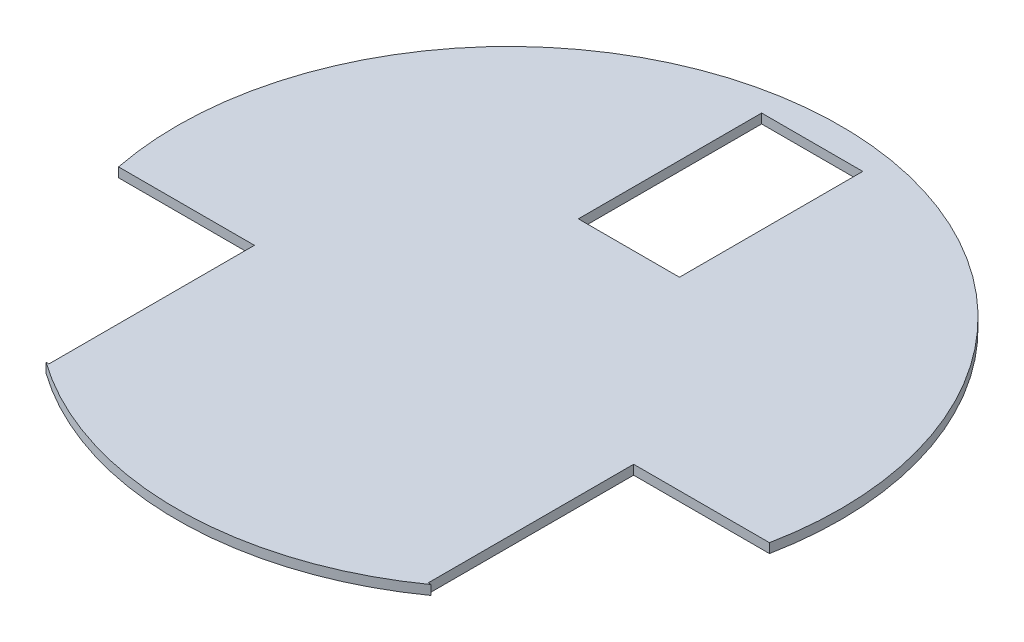
ISO-10303-21;
HEADER;
FILE_DESCRIPTION(('STEP AP214'),'2;1');
FILE_NAME('part.step','',(''),(''),'','','');
FILE_SCHEMA(('AUTOMOTIVE_DESIGN { 1 0 10303 214 1 1 1 1 }'));
ENDSEC;
DATA;
#1=APPLICATION_CONTEXT('core data for automotive mechanical design processes');
#2=APPLICATION_PROTOCOL_DEFINITION('international standard','automotive_design',2000,#1);
#3=PRODUCT_CONTEXT('',#1,'mechanical');
#4=PRODUCT('Part','Part','',(#3));
#5=PRODUCT_RELATED_PRODUCT_CATEGORY('part','',(#4));
#6=PRODUCT_DEFINITION_FORMATION('','',#4);
#7=PRODUCT_DEFINITION_CONTEXT('part definition',#1,'design');
#8=PRODUCT_DEFINITION('design','',#6,#7);
#9=PRODUCT_DEFINITION_SHAPE('','',#8);
#10=(LENGTH_UNIT() NAMED_UNIT(*) SI_UNIT(.MILLI.,.METRE.));
#11=(NAMED_UNIT(*) PLANE_ANGLE_UNIT() SI_UNIT($,.RADIAN.));
#12=(NAMED_UNIT(*) SI_UNIT($,.STERADIAN.) SOLID_ANGLE_UNIT());
#13=UNCERTAINTY_MEASURE_WITH_UNIT(LENGTH_MEASURE(1.E-05),#10,'distance_accuracy_value','');
#14=(GEOMETRIC_REPRESENTATION_CONTEXT(3) GLOBAL_UNCERTAINTY_ASSIGNED_CONTEXT((#13)) GLOBAL_UNIT_ASSIGNED_CONTEXT((#10,
#11,#12)) REPRESENTATION_CONTEXT('',''));
#15=CARTESIAN_POINT('',(0.,0.,0.));
#16=DIRECTION('',(0.,0.,1.));
#17=DIRECTION('',(1.,0.,0.));
#18=AXIS2_PLACEMENT_3D('',#15,#16,#17);
#19=CARTESIAN_POINT('',(0.,3.,0.));
#20=DIRECTION('',(0.,-1.,0.));
#21=DIRECTION('',(0.,0.,-1.));
#22=AXIS2_PLACEMENT_3D('',#19,#20,#21);
#23=CYLINDRICAL_SURFACE('',#22,105.);
#24=DIRECTION('',(0.,1.,0.));
#25=VECTOR('',#24,1.);
#26=CARTESIAN_POINT('',(60.9487489617301,0.,85.5));
#27=LINE('',#26,#25);
#28=CARTESIAN_POINT('',(60.9487489617301,0.,85.5));
#29=VERTEX_POINT('',#28);
#30=CARTESIAN_POINT('',(60.9487489617301,3.,85.5));
#31=VERTEX_POINT('',#30);
#32=EDGE_CURVE('E178',#29,#31,#27,.T.);
#33=ORIENTED_EDGE('',*,*,#32,.T.);
#34=CARTESIAN_POINT('',(0.,3.,0.));
#35=DIRECTION('',(0.,1.,0.));
#36=DIRECTION('',(0.,0.,1.));
#37=AXIS2_PLACEMENT_3D('',#34,#35,#36);
#38=CIRCLE('',#37,105.);
#39=CARTESIAN_POINT('',(-60.9487489617301,3.,85.5));
#40=VERTEX_POINT('',#39);
#41=EDGE_CURVE('E11',#40,#31,#38,.T.);
#42=ORIENTED_EDGE('',*,*,#41,.F.);
#43=DIRECTION('',(0.,1.,0.));
#44=VECTOR('',#43,1.);
#45=CARTESIAN_POINT('',(-60.9487489617301,0.,85.5));
#46=LINE('',#45,#44);
#47=CARTESIAN_POINT('',(-60.9487489617301,0.,85.5));
#48=VERTEX_POINT('',#47);
#49=EDGE_CURVE('E206',#48,#40,#46,.T.);
#50=ORIENTED_EDGE('',*,*,#49,.F.);
#51=CARTESIAN_POINT('',(0.,0.,0.));
#52=DIRECTION('',(0.,1.,0.));
#53=DIRECTION('',(0.,0.,1.));
#54=AXIS2_PLACEMENT_3D('',#51,#52,#53);
#55=CIRCLE('',#54,105.);
#56=EDGE_CURVE('E38',#48,#29,#55,.T.);
#57=ORIENTED_EDGE('',*,*,#56,.T.);
#58=EDGE_LOOP('',(#33,#42,#50,#57));
#59=FACE_BOUND('',#58,.T.);
#60=ADVANCED_FACE('F34',(#59),#23,.T.);
#61=CARTESIAN_POINT('',(0.,3.,0.));
#62=DIRECTION('',(0.,1.,0.));
#63=DIRECTION('',(0.,0.,1.));
#64=AXIS2_PLACEMENT_3D('',#61,#62,#63);
#65=PLANE('',#64);
#66=DIRECTION('',(0.,0.,1.));
#67=VECTOR('',#66,1.);
#68=CARTESIAN_POINT('',(-16.,3.,-96.));
#69=LINE('',#68,#67);
#70=CARTESIAN_POINT('',(-16.,3.,-96.));
#71=VERTEX_POINT('',#70);
#72=CARTESIAN_POINT('',(-16.,3.,-38.));
#73=VERTEX_POINT('',#72);
#74=EDGE_CURVE('E50',#71,#73,#69,.T.);
#75=ORIENTED_EDGE('',*,*,#74,.F.);
#76=DIRECTION('',(-1.,0.,0.));
#77=VECTOR('',#76,1.);
#78=CARTESIAN_POINT('',(-16.,3.,-96.));
#79=LINE('',#78,#77);
#80=CARTESIAN_POINT('',(16.,3.,-96.));
#81=VERTEX_POINT('',#80);
#82=EDGE_CURVE('E142',#81,#71,#79,.T.);
#83=ORIENTED_EDGE('',*,*,#82,.F.);
#84=DIRECTION('',(0.,0.,-1.));
#85=VECTOR('',#84,1.);
#86=CARTESIAN_POINT('',(16.,3.,-96.));
#87=LINE('',#86,#85);
#88=CARTESIAN_POINT('',(16.,3.,-38.));
#89=VERTEX_POINT('',#88);
#90=EDGE_CURVE('E145',#89,#81,#87,.T.);
#91=ORIENTED_EDGE('',*,*,#90,.F.);
#92=DIRECTION('',(1.,0.,0.));
#93=VECTOR('',#92,1.);
#94=CARTESIAN_POINT('',(-16.,3.,-38.));
#95=LINE('',#94,#93);
#96=EDGE_CURVE('E151',#73,#89,#95,.T.);
#97=ORIENTED_EDGE('',*,*,#96,.F.);
#98=EDGE_LOOP('',(#75,#83,#91,#97));
#99=FACE_BOUND('',#98,.T.);
#100=ORIENTED_EDGE('',*,*,#41,.T.);
#101=DIRECTION('',(-1.,0.,0.));
#102=VECTOR('',#101,1.);
#103=CARTESIAN_POINT('',(0.,3.,85.5));
#104=LINE('',#103,#102);
#105=CARTESIAN_POINT('',(60.,3.,85.5));
#106=VERTEX_POINT('',#105);
#107=EDGE_CURVE('E165',#31,#106,#104,.T.);
#108=ORIENTED_EDGE('',*,*,#107,.T.);
#109=DIRECTION('',(0.,0.,1.));
#110=VECTOR('',#109,1.);
#111=CARTESIAN_POINT('',(60.,3.,0.));
#112=LINE('',#111,#110);
#113=CARTESIAN_POINT('',(60.,3.,20.5));
#114=VERTEX_POINT('',#113);
#115=EDGE_CURVE('E173',#114,#106,#112,.T.);
#116=ORIENTED_EDGE('',*,*,#115,.F.);
#117=DIRECTION('',(-1.,0.,0.));
#118=VECTOR('',#117,1.);
#119=CARTESIAN_POINT('',(0.,3.,20.5));
#120=LINE('',#119,#118);
#121=CARTESIAN_POINT('',(102.979366865407,3.,20.5));
#122=VERTEX_POINT('',#121);
#123=EDGE_CURVE('E157',#122,#114,#120,.T.);
#124=ORIENTED_EDGE('',*,*,#123,.F.);
#125=CARTESIAN_POINT('',(-102.979366865407,3.,20.5));
#126=VERTEX_POINT('',#125);
#127=EDGE_CURVE('E43',#122,#126,#38,.T.);
#128=ORIENTED_EDGE('',*,*,#127,.T.);
#129=DIRECTION('',(1.,0.,0.));
#130=VECTOR('',#129,1.);
#131=CARTESIAN_POINT('',(0.,3.,20.5));
#132=LINE('',#131,#130);
#133=CARTESIAN_POINT('',(-60.,3.,20.5));
#134=VERTEX_POINT('',#133);
#135=EDGE_CURVE('E198',#126,#134,#132,.T.);
#136=ORIENTED_EDGE('',*,*,#135,.T.);
#137=DIRECTION('',(0.,0.,1.));
#138=VECTOR('',#137,1.);
#139=CARTESIAN_POINT('',(-60.,3.,0.));
#140=LINE('',#139,#138);
#141=CARTESIAN_POINT('',(-60.,3.,85.5));
#142=VERTEX_POINT('',#141);
#143=EDGE_CURVE('E181',#134,#142,#140,.T.);
#144=ORIENTED_EDGE('',*,*,#143,.T.);
#145=DIRECTION('',(1.,0.,0.));
#146=VECTOR('',#145,1.);
#147=CARTESIAN_POINT('',(0.,3.,85.5));
#148=LINE('',#147,#146);
#149=EDGE_CURVE('E190',#40,#142,#148,.T.);
#150=ORIENTED_EDGE('',*,*,#149,.F.);
#151=EDGE_LOOP('',(#100,#108,#116,#124,#128,#136,#144,#150));
#152=FACE_BOUND('',#151,.T.);
#153=ADVANCED_FACE('F224',(#99,#152),#65,.T.);
#154=CARTESIAN_POINT('',(0.,0.,0.));
#155=DIRECTION('',(0.,1.,0.));
#156=DIRECTION('',(0.,0.,1.));
#157=AXIS2_PLACEMENT_3D('',#154,#155,#156);
#158=PLANE('',#157);
#159=DIRECTION('',(-1.,0.,0.));
#160=VECTOR('',#159,1.);
#161=CARTESIAN_POINT('',(-16.,0.,-96.));
#162=LINE('',#161,#160);
#163=CARTESIAN_POINT('',(16.,0.,-96.));
#164=VERTEX_POINT('',#163);
#165=CARTESIAN_POINT('',(-16.,0.,-96.));
#166=VERTEX_POINT('',#165);
#167=EDGE_CURVE('E132',#164,#166,#162,.T.);
#168=ORIENTED_EDGE('',*,*,#167,.T.);
#169=DIRECTION('',(0.,0.,1.));
#170=VECTOR('',#169,1.);
#171=CARTESIAN_POINT('',(-16.,0.,-96.));
#172=LINE('',#171,#170);
#173=CARTESIAN_POINT('',(-16.,0.,-38.));
#174=VERTEX_POINT('',#173);
#175=EDGE_CURVE('E126',#166,#174,#172,.T.);
#176=ORIENTED_EDGE('',*,*,#175,.T.);
#177=DIRECTION('',(1.,0.,0.));
#178=VECTOR('',#177,1.);
#179=CARTESIAN_POINT('',(-16.,0.,-38.));
#180=LINE('',#179,#178);
#181=CARTESIAN_POINT('',(16.,0.,-38.));
#182=VERTEX_POINT('',#181);
#183=EDGE_CURVE('E135',#174,#182,#180,.T.);
#184=ORIENTED_EDGE('',*,*,#183,.T.);
#185=DIRECTION('',(0.,0.,-1.));
#186=VECTOR('',#185,1.);
#187=CARTESIAN_POINT('',(16.,0.,-96.));
#188=LINE('',#187,#186);
#189=EDGE_CURVE('E58',#182,#164,#188,.T.);
#190=ORIENTED_EDGE('',*,*,#189,.T.);
#191=EDGE_LOOP('',(#168,#176,#184,#190));
#192=FACE_BOUND('',#191,.T.);
#193=DIRECTION('',(-1.,0.,0.));
#194=VECTOR('',#193,1.);
#195=CARTESIAN_POINT('',(0.,0.,85.5));
#196=LINE('',#195,#194);
#197=CARTESIAN_POINT('',(60.,0.,85.5));
#198=VERTEX_POINT('',#197);
#199=EDGE_CURVE('E168',#29,#198,#196,.T.);
#200=ORIENTED_EDGE('',*,*,#199,.F.);
#201=ORIENTED_EDGE('',*,*,#56,.F.);
#202=DIRECTION('',(1.,0.,0.));
#203=VECTOR('',#202,1.);
#204=CARTESIAN_POINT('',(0.,0.,85.5));
#205=LINE('',#204,#203);
#206=CARTESIAN_POINT('',(-60.,0.,85.5));
#207=VERTEX_POINT('',#206);
#208=EDGE_CURVE('E192',#48,#207,#205,.T.);
#209=ORIENTED_EDGE('',*,*,#208,.T.);
#210=DIRECTION('',(0.,0.,1.));
#211=VECTOR('',#210,1.);
#212=CARTESIAN_POINT('',(-60.,0.,0.));
#213=LINE('',#212,#211);
#214=CARTESIAN_POINT('',(-60.,0.,20.5));
#215=VERTEX_POINT('',#214);
#216=EDGE_CURVE('E187',#215,#207,#213,.T.);
#217=ORIENTED_EDGE('',*,*,#216,.F.);
#218=DIRECTION('',(1.,0.,0.));
#219=VECTOR('',#218,1.);
#220=CARTESIAN_POINT('',(0.,0.,20.5));
#221=LINE('',#220,#219);
#222=CARTESIAN_POINT('',(-102.979366865407,0.,20.5));
#223=VERTEX_POINT('',#222);
#224=EDGE_CURVE('E189',#223,#215,#221,.T.);
#225=ORIENTED_EDGE('',*,*,#224,.F.);
#226=CARTESIAN_POINT('',(102.979366865407,0.,20.5));
#227=VERTEX_POINT('',#226);
#228=EDGE_CURVE('E205',#227,#223,#55,.T.);
#229=ORIENTED_EDGE('',*,*,#228,.F.);
#230=DIRECTION('',(-1.,0.,0.));
#231=VECTOR('',#230,1.);
#232=CARTESIAN_POINT('',(0.,0.,20.5));
#233=LINE('',#232,#231);
#234=CARTESIAN_POINT('',(60.,0.,20.5));
#235=VERTEX_POINT('',#234);
#236=EDGE_CURVE('E161',#227,#235,#233,.T.);
#237=ORIENTED_EDGE('',*,*,#236,.T.);
#238=DIRECTION('',(0.,0.,1.));
#239=VECTOR('',#238,1.);
#240=CARTESIAN_POINT('',(60.,0.,0.));
#241=LINE('',#240,#239);
#242=EDGE_CURVE('E164',#235,#198,#241,.T.);
#243=ORIENTED_EDGE('',*,*,#242,.T.);
#244=EDGE_LOOP('',(#200,#201,#209,#217,#225,#229,#237,#243));
#245=FACE_BOUND('',#244,.T.);
#246=ADVANCED_FACE('F139',(#192,#245),#158,.F.);
#247=ORIENTED_EDGE('',*,*,#127,.F.);
#248=DIRECTION('',(0.,1.,0.));
#249=VECTOR('',#248,1.);
#250=CARTESIAN_POINT('',(102.979366865407,0.,20.5));
#251=LINE('',#250,#249);
#252=EDGE_CURVE('E170',#227,#122,#251,.T.);
#253=ORIENTED_EDGE('',*,*,#252,.F.);
#254=ORIENTED_EDGE('',*,*,#228,.T.);
#255=DIRECTION('',(0.,1.,0.));
#256=VECTOR('',#255,1.);
#257=CARTESIAN_POINT('',(-102.979366865407,0.,20.5));
#258=LINE('',#257,#256);
#259=EDGE_CURVE('E208',#223,#126,#258,.T.);
#260=ORIENTED_EDGE('',*,*,#259,.T.);
#261=EDGE_LOOP('',(#247,#253,#254,#260));
#262=FACE_BOUND('',#261,.T.);
#263=ADVANCED_FACE('F36',(#262),#23,.T.);
#264=CARTESIAN_POINT('',(-60.,0.,0.));
#265=DIRECTION('',(-1.,0.,0.));
#266=DIRECTION('',(0.,0.,1.));
#267=AXIS2_PLACEMENT_3D('',#264,#265,#266);
#268=PLANE('',#267);
#269=ORIENTED_EDGE('',*,*,#143,.F.);
#270=DIRECTION('',(0.,1.,0.));
#271=VECTOR('',#270,1.);
#272=CARTESIAN_POINT('',(-60.,0.,20.5));
#273=LINE('',#272,#271);
#274=EDGE_CURVE('E195',#215,#134,#273,.T.);
#275=ORIENTED_EDGE('',*,*,#274,.F.);
#276=ORIENTED_EDGE('',*,*,#216,.T.);
#277=DIRECTION('',(0.,1.,0.));
#278=VECTOR('',#277,1.);
#279=CARTESIAN_POINT('',(-60.,0.,85.5));
#280=LINE('',#279,#278);
#281=EDGE_CURVE('E203',#207,#142,#280,.T.);
#282=ORIENTED_EDGE('',*,*,#281,.T.);
#283=EDGE_LOOP('',(#269,#275,#276,#282));
#284=FACE_BOUND('',#283,.T.);
#285=ADVANCED_FACE('F220',(#284),#268,.T.);
#286=CARTESIAN_POINT('',(0.,0.,85.5));
#287=DIRECTION('',(0.,0.,1.));
#288=DIRECTION('',(1.,0.,0.));
#289=AXIS2_PLACEMENT_3D('',#286,#287,#288);
#290=PLANE('',#289);
#291=ORIENTED_EDGE('',*,*,#149,.T.);
#292=ORIENTED_EDGE('',*,*,#281,.F.);
#293=ORIENTED_EDGE('',*,*,#208,.F.);
#294=ORIENTED_EDGE('',*,*,#49,.T.);
#295=EDGE_LOOP('',(#291,#292,#293,#294));
#296=FACE_BOUND('',#295,.T.);
#297=ADVANCED_FACE('F237',(#296),#290,.F.);
#298=CARTESIAN_POINT('',(0.,0.,20.5));
#299=DIRECTION('',(0.,0.,1.));
#300=DIRECTION('',(1.,0.,0.));
#301=AXIS2_PLACEMENT_3D('',#298,#299,#300);
#302=PLANE('',#301);
#303=ORIENTED_EDGE('',*,*,#135,.F.);
#304=ORIENTED_EDGE('',*,*,#259,.F.);
#305=ORIENTED_EDGE('',*,*,#224,.T.);
#306=ORIENTED_EDGE('',*,*,#274,.T.);
#307=EDGE_LOOP('',(#303,#304,#305,#306));
#308=FACE_BOUND('',#307,.T.);
#309=ADVANCED_FACE('F215',(#308),#302,.T.);
#310=CARTESIAN_POINT('',(0.,0.,85.5));
#311=DIRECTION('',(0.,0.,-1.));
#312=DIRECTION('',(-1.,0.,0.));
#313=AXIS2_PLACEMENT_3D('',#310,#311,#312);
#314=PLANE('',#313);
#315=ORIENTED_EDGE('',*,*,#107,.F.);
#316=ORIENTED_EDGE('',*,*,#32,.F.);
#317=ORIENTED_EDGE('',*,*,#199,.T.);
#318=DIRECTION('',(0.,1.,0.));
#319=VECTOR('',#318,1.);
#320=CARTESIAN_POINT('',(60.,0.,85.5));
#321=LINE('',#320,#319);
#322=EDGE_CURVE('E182',#198,#106,#321,.T.);
#323=ORIENTED_EDGE('',*,*,#322,.T.);
#324=EDGE_LOOP('',(#315,#316,#317,#323));
#325=FACE_BOUND('',#324,.T.);
#326=ADVANCED_FACE('F240',(#325),#314,.T.);
#327=CARTESIAN_POINT('',(60.,0.,0.));
#328=DIRECTION('',(-1.,0.,0.));
#329=DIRECTION('',(0.,0.,1.));
#330=AXIS2_PLACEMENT_3D('',#327,#328,#329);
#331=PLANE('',#330);
#332=ORIENTED_EDGE('',*,*,#115,.T.);
#333=ORIENTED_EDGE('',*,*,#322,.F.);
#334=ORIENTED_EDGE('',*,*,#242,.F.);
#335=DIRECTION('',(0.,1.,0.));
#336=VECTOR('',#335,1.);
#337=CARTESIAN_POINT('',(60.,0.,20.5));
#338=LINE('',#337,#336);
#339=EDGE_CURVE('E184',#235,#114,#338,.T.);
#340=ORIENTED_EDGE('',*,*,#339,.T.);
#341=EDGE_LOOP('',(#332,#333,#334,#340));
#342=FACE_BOUND('',#341,.T.);
#343=ADVANCED_FACE('F244',(#342),#331,.F.);
#344=CARTESIAN_POINT('',(0.,0.,20.5));
#345=DIRECTION('',(0.,0.,-1.));
#346=DIRECTION('',(-1.,0.,0.));
#347=AXIS2_PLACEMENT_3D('',#344,#345,#346);
#348=PLANE('',#347);
#349=ORIENTED_EDGE('',*,*,#123,.T.);
#350=ORIENTED_EDGE('',*,*,#339,.F.);
#351=ORIENTED_EDGE('',*,*,#236,.F.);
#352=ORIENTED_EDGE('',*,*,#252,.T.);
#353=EDGE_LOOP('',(#349,#350,#351,#352));
#354=FACE_BOUND('',#353,.T.);
#355=ADVANCED_FACE('F246',(#354),#348,.F.);
#356=CARTESIAN_POINT('',(-16.,0.,-96.));
#357=DIRECTION('',(-1.,0.,0.));
#358=DIRECTION('',(0.,0.,1.));
#359=AXIS2_PLACEMENT_3D('',#356,#357,#358);
#360=PLANE('',#359);
#361=ORIENTED_EDGE('',*,*,#74,.T.);
#362=DIRECTION('',(0.,1.,0.));
#363=VECTOR('',#362,1.);
#364=CARTESIAN_POINT('',(-16.,0.,-38.));
#365=LINE('',#364,#363);
#366=EDGE_CURVE('E122',#174,#73,#365,.T.);
#367=ORIENTED_EDGE('',*,*,#366,.F.);
#368=ORIENTED_EDGE('',*,*,#175,.F.);
#369=DIRECTION('',(0.,1.,0.));
#370=VECTOR('',#369,1.);
#371=CARTESIAN_POINT('',(-16.,0.,-96.));
#372=LINE('',#371,#370);
#373=EDGE_CURVE('E155',#166,#71,#372,.T.);
#374=ORIENTED_EDGE('',*,*,#373,.T.);
#375=EDGE_LOOP('',(#361,#367,#368,#374));
#376=FACE_BOUND('',#375,.T.);
#377=ADVANCED_FACE('F124',(#376),#360,.F.);
#378=CARTESIAN_POINT('',(-16.,0.,-96.));
#379=DIRECTION('',(0.,0.,-1.));
#380=DIRECTION('',(-1.,0.,0.));
#381=AXIS2_PLACEMENT_3D('',#378,#379,#380);
#382=PLANE('',#381);
#383=ORIENTED_EDGE('',*,*,#82,.T.);
#384=ORIENTED_EDGE('',*,*,#373,.F.);
#385=ORIENTED_EDGE('',*,*,#167,.F.);
#386=DIRECTION('',(0.,1.,0.));
#387=VECTOR('',#386,1.);
#388=CARTESIAN_POINT('',(16.,0.,-96.));
#389=LINE('',#388,#387);
#390=EDGE_CURVE('E158',#164,#81,#389,.T.);
#391=ORIENTED_EDGE('',*,*,#390,.T.);
#392=EDGE_LOOP('',(#383,#384,#385,#391));
#393=FACE_BOUND('',#392,.T.);
#394=ADVANCED_FACE('F253',(#393),#382,.F.);
#395=CARTESIAN_POINT('',(16.,0.,-96.));
#396=DIRECTION('',(1.,0.,0.));
#397=DIRECTION('',(0.,0.,-1.));
#398=AXIS2_PLACEMENT_3D('',#395,#396,#397);
#399=PLANE('',#398);
#400=ORIENTED_EDGE('',*,*,#90,.T.);
#401=ORIENTED_EDGE('',*,*,#390,.F.);
#402=ORIENTED_EDGE('',*,*,#189,.F.);
#403=DIRECTION('',(0.,1.,0.));
#404=VECTOR('',#403,1.);
#405=CARTESIAN_POINT('',(16.,0.,-38.));
#406=LINE('',#405,#404);
#407=EDGE_CURVE('E131',#182,#89,#406,.T.);
#408=ORIENTED_EDGE('',*,*,#407,.T.);
#409=EDGE_LOOP('',(#400,#401,#402,#408));
#410=FACE_BOUND('',#409,.T.);
#411=ADVANCED_FACE('F323',(#410),#399,.F.);
#412=CARTESIAN_POINT('',(-16.,0.,-38.));
#413=DIRECTION('',(0.,0.,1.));
#414=DIRECTION('',(1.,0.,0.));
#415=AXIS2_PLACEMENT_3D('',#412,#413,#414);
#416=PLANE('',#415);
#417=ORIENTED_EDGE('',*,*,#96,.T.);
#418=ORIENTED_EDGE('',*,*,#407,.F.);
#419=ORIENTED_EDGE('',*,*,#183,.F.);
#420=ORIENTED_EDGE('',*,*,#366,.T.);
#421=EDGE_LOOP('',(#417,#418,#419,#420));
#422=FACE_BOUND('',#421,.T.);
#423=ADVANCED_FACE('F136',(#422),#416,.F.);
#424=CLOSED_SHELL('',(#60,#153,#246,#263,#285,#297,#309,#326,#343,#355,#377,#394,#411,#423));
#425=MANIFOLD_SOLID_BREP('B2',#424);
#426=ADVANCED_BREP_SHAPE_REPRESENTATION('',(#18,#425),#14);
#427=SHAPE_DEFINITION_REPRESENTATION(#9,#426);
ENDSEC;
END-ISO-10303-21;
